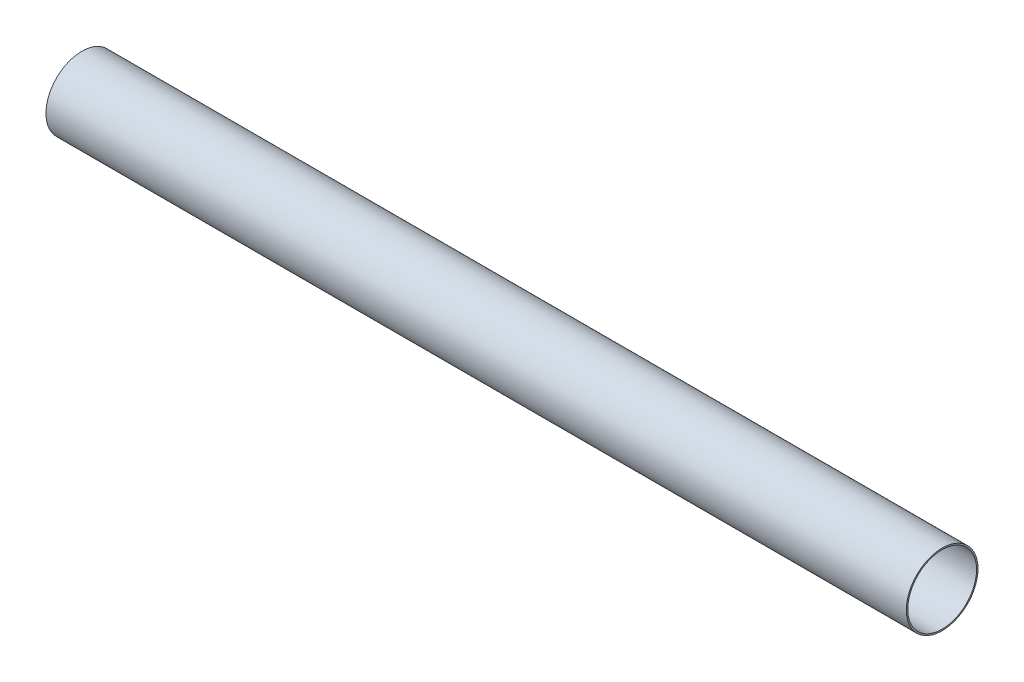
ISO-10303-21;
HEADER;
FILE_DESCRIPTION(('STEP AP214'),'2;1');
FILE_NAME('part.step','',(''),(''),'','','');
FILE_SCHEMA(('AUTOMOTIVE_DESIGN { 1 0 10303 214 1 1 1 1 }'));
ENDSEC;
DATA;
#1=APPLICATION_CONTEXT('core data for automotive mechanical design processes');
#2=APPLICATION_PROTOCOL_DEFINITION('international standard','automotive_design',2000,#1);
#3=PRODUCT_CONTEXT('',#1,'mechanical');
#4=PRODUCT('Part','Part','',(#3));
#5=PRODUCT_RELATED_PRODUCT_CATEGORY('part','',(#4));
#6=PRODUCT_DEFINITION_FORMATION('','',#4);
#7=PRODUCT_DEFINITION_CONTEXT('part definition',#1,'design');
#8=PRODUCT_DEFINITION('design','',#6,#7);
#9=PRODUCT_DEFINITION_SHAPE('','',#8);
#10=(LENGTH_UNIT() NAMED_UNIT(*) SI_UNIT(.MILLI.,.METRE.));
#11=(NAMED_UNIT(*) PLANE_ANGLE_UNIT() SI_UNIT($,.RADIAN.));
#12=(NAMED_UNIT(*) SI_UNIT($,.STERADIAN.) SOLID_ANGLE_UNIT());
#13=UNCERTAINTY_MEASURE_WITH_UNIT(LENGTH_MEASURE(1.E-05),#10,'distance_accuracy_value','');
#14=(GEOMETRIC_REPRESENTATION_CONTEXT(3) GLOBAL_UNCERTAINTY_ASSIGNED_CONTEXT((#13)) GLOBAL_UNIT_ASSIGNED_CONTEXT((#10,
#11,#12)) REPRESENTATION_CONTEXT('',''));
#15=CARTESIAN_POINT('',(0.,0.,0.));
#16=DIRECTION('',(0.,0.,1.));
#17=DIRECTION('',(1.,0.,0.));
#18=AXIS2_PLACEMENT_3D('',#15,#16,#17);
#19=CARTESIAN_POINT('',(72.,0.,0.));
#20=DIRECTION('',(1.,0.,0.));
#21=DIRECTION('',(0.,0.,-1.));
#22=AXIS2_PLACEMENT_3D('',#19,#20,#21);
#23=PLANE('',#22);
#24=CARTESIAN_POINT('',(72.,0.,0.));
#25=DIRECTION('',(1.,0.,0.));
#26=DIRECTION('',(0.,0.,-1.));
#27=AXIS2_PLACEMENT_3D('',#24,#25,#26);
#28=CIRCLE('',#27,3.);
#29=CARTESIAN_POINT('',(72.,0.,-3.));
#30=VERTEX_POINT('',#29);
#31=EDGE_CURVE('E10',#30,#30,#28,.T.);
#32=ORIENTED_EDGE('',*,*,#31,.T.);
#33=EDGE_LOOP('',(#32));
#34=FACE_BOUND('',#33,.T.);
#35=CARTESIAN_POINT('',(72.,0.,0.));
#36=DIRECTION('',(1.,0.,0.));
#37=DIRECTION('',(0.,0.,-1.));
#38=AXIS2_PLACEMENT_3D('',#35,#36,#37);
#39=CIRCLE('',#38,2.88);
#40=CARTESIAN_POINT('',(72.,0.,-2.88));
#41=VERTEX_POINT('',#40);
#42=EDGE_CURVE('E42',#41,#41,#39,.T.);
#43=ORIENTED_EDGE('',*,*,#42,.F.);
#44=EDGE_LOOP('',(#43));
#45=FACE_BOUND('',#44,.T.);
#46=ADVANCED_FACE('F31',(#34,#45),#23,.T.);
#47=CARTESIAN_POINT('',(0.,0.,0.));
#48=DIRECTION('',(1.,0.,0.));
#49=DIRECTION('',(0.,0.,-1.));
#50=AXIS2_PLACEMENT_3D('',#47,#48,#49);
#51=PLANE('',#50);
#52=CARTESIAN_POINT('',(0.,0.,0.));
#53=DIRECTION('',(1.,0.,0.));
#54=DIRECTION('',(0.,0.,-1.));
#55=AXIS2_PLACEMENT_3D('',#52,#53,#54);
#56=CIRCLE('',#55,3.);
#57=CARTESIAN_POINT('',(0.,0.,-3.));
#58=VERTEX_POINT('',#57);
#59=EDGE_CURVE('E35',#58,#58,#56,.T.);
#60=ORIENTED_EDGE('',*,*,#59,.F.);
#61=EDGE_LOOP('',(#60));
#62=FACE_BOUND('',#61,.T.);
#63=CARTESIAN_POINT('',(0.,0.,0.));
#64=DIRECTION('',(1.,0.,0.));
#65=DIRECTION('',(0.,0.,-1.));
#66=AXIS2_PLACEMENT_3D('',#63,#64,#65);
#67=CIRCLE('',#66,2.88);
#68=CARTESIAN_POINT('',(0.,0.,-2.88));
#69=VERTEX_POINT('',#68);
#70=EDGE_CURVE('E44',#69,#69,#67,.T.);
#71=ORIENTED_EDGE('',*,*,#70,.T.);
#72=EDGE_LOOP('',(#71));
#73=FACE_BOUND('',#72,.T.);
#74=ADVANCED_FACE('F54',(#62,#73),#51,.F.);
#75=CARTESIAN_POINT('',(72.,0.,0.));
#76=DIRECTION('',(-1.,0.,0.));
#77=DIRECTION('',(0.,0.,1.));
#78=AXIS2_PLACEMENT_3D('',#75,#76,#77);
#79=CYLINDRICAL_SURFACE('',#78,3.);
#80=ORIENTED_EDGE('',*,*,#31,.F.);
#81=EDGE_LOOP('',(#80));
#82=FACE_BOUND('',#81,.T.);
#83=ORIENTED_EDGE('',*,*,#59,.T.);
#84=EDGE_LOOP('',(#83));
#85=FACE_BOUND('',#84,.T.);
#86=ADVANCED_FACE('F33',(#82,#85),#79,.T.);
#87=CARTESIAN_POINT('',(72.,0.,0.));
#88=DIRECTION('',(-1.,0.,0.));
#89=DIRECTION('',(0.,0.,1.));
#90=AXIS2_PLACEMENT_3D('',#87,#88,#89);
#91=CYLINDRICAL_SURFACE('',#90,2.88);
#92=ORIENTED_EDGE('',*,*,#42,.T.);
#93=EDGE_LOOP('',(#92));
#94=FACE_BOUND('',#93,.T.);
#95=ORIENTED_EDGE('',*,*,#70,.F.);
#96=EDGE_LOOP('',(#95));
#97=FACE_BOUND('',#96,.T.);
#98=ADVANCED_FACE('F50',(#94,#97),#91,.F.);
#99=CLOSED_SHELL('',(#46,#74,#86,#98));
#100=MANIFOLD_SOLID_BREP('B2',#99);
#101=ADVANCED_BREP_SHAPE_REPRESENTATION('',(#18,#100),#14);
#102=SHAPE_DEFINITION_REPRESENTATION(#9,#101);
ENDSEC;
END-ISO-10303-21;
